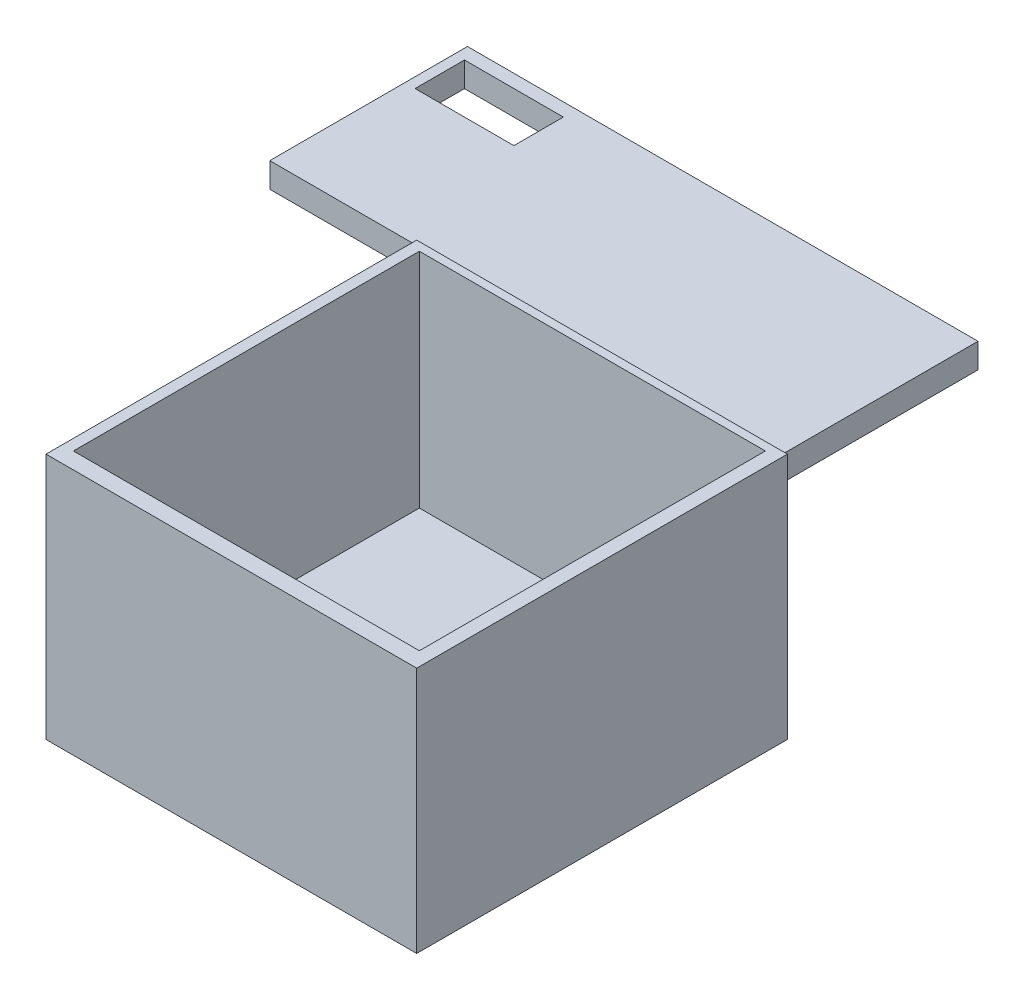
ISO-10303-21;
HEADER;
FILE_DESCRIPTION(('STEP AP214'),'2;1');
FILE_NAME('part.step','',(''),(''),'','','');
FILE_SCHEMA(('AUTOMOTIVE_DESIGN { 1 0 10303 214 1 1 1 1 }'));
ENDSEC;
DATA;
#1=APPLICATION_CONTEXT('core data for automotive mechanical design processes');
#2=APPLICATION_PROTOCOL_DEFINITION('international standard','automotive_design',2000,#1);
#3=PRODUCT_CONTEXT('',#1,'mechanical');
#4=PRODUCT('Part','Part','',(#3));
#5=PRODUCT_RELATED_PRODUCT_CATEGORY('part','',(#4));
#6=PRODUCT_DEFINITION_FORMATION('','',#4);
#7=PRODUCT_DEFINITION_CONTEXT('part definition',#1,'design');
#8=PRODUCT_DEFINITION('design','',#6,#7);
#9=PRODUCT_DEFINITION_SHAPE('','',#8);
#10=(LENGTH_UNIT() NAMED_UNIT(*) SI_UNIT(.MILLI.,.METRE.));
#11=(NAMED_UNIT(*) PLANE_ANGLE_UNIT() SI_UNIT($,.RADIAN.));
#12=(NAMED_UNIT(*) SI_UNIT($,.STERADIAN.) SOLID_ANGLE_UNIT());
#13=UNCERTAINTY_MEASURE_WITH_UNIT(LENGTH_MEASURE(1.E-05),#10,'distance_accuracy_value','');
#14=(GEOMETRIC_REPRESENTATION_CONTEXT(3) GLOBAL_UNCERTAINTY_ASSIGNED_CONTEXT((#13)) GLOBAL_UNIT_ASSIGNED_CONTEXT((#10,
#11,#12)) REPRESENTATION_CONTEXT('',''));
#15=CARTESIAN_POINT('',(0.,0.,0.));
#16=DIRECTION('',(0.,0.,1.));
#17=DIRECTION('',(1.,0.,0.));
#18=AXIS2_PLACEMENT_3D('',#15,#16,#17);
#19=CARTESIAN_POINT('',(-136.989619377163,100.,-6.05536332179931));
#20=DIRECTION('',(0.,0.,1.));
#21=DIRECTION('',(1.,0.,0.));
#22=AXIS2_PLACEMENT_3D('',#19,#20,#21);
#23=PLANE('',#22);
#24=DIRECTION('',(1.,0.,0.));
#25=VECTOR('',#24,1.);
#26=CARTESIAN_POINT('',(10.1416415350002,98.1246631452138,-6.05536332179931));
#27=LINE('',#26,#25);
#28=CARTESIAN_POINT('',(-136.989619377163,98.1246631452138,-6.05536332179931));
#29=VERTEX_POINT('',#28);
#30=CARTESIAN_POINT('',(10.1416415350002,98.1246631452138,-6.05536332179931));
#31=VERTEX_POINT('',#30);
#32=EDGE_CURVE('E206',#29,#31,#27,.T.);
#33=ORIENTED_EDGE('',*,*,#32,.F.);
#34=DIRECTION('',(0.,-1.,0.));
#35=VECTOR('',#34,1.);
#36=CARTESIAN_POINT('',(-136.989619377163,100.,-6.05536332179931));
#37=LINE('',#36,#35);
#38=CARTESIAN_POINT('',(-136.989619377163,100.,-6.05536332179931));
#39=VERTEX_POINT('',#38);
#40=EDGE_CURVE('E270',#39,#29,#37,.T.);
#41=ORIENTED_EDGE('',*,*,#40,.F.);
#42=DIRECTION('',(-1.,0.,0.));
#43=VECTOR('',#42,1.);
#44=CARTESIAN_POINT('',(-136.989619377163,100.,-6.05536332179931));
#45=LINE('',#44,#43);
#46=CARTESIAN_POINT('',(13.0103806228373,100.,-6.05536332179931));
#47=VERTEX_POINT('',#46);
#48=EDGE_CURVE('E259',#47,#39,#45,.T.);
#49=ORIENTED_EDGE('',*,*,#48,.F.);
#50=DIRECTION('',(0.,-1.,0.));
#51=VECTOR('',#50,1.);
#52=CARTESIAN_POINT('',(13.0103806228373,100.,-6.05536332179931));
#53=LINE('',#52,#51);
#54=CARTESIAN_POINT('',(13.0103806228373,0.,-6.05536332179931));
#55=VERTEX_POINT('',#54);
#56=EDGE_CURVE('E273',#47,#55,#53,.T.);
#57=ORIENTED_EDGE('',*,*,#56,.T.);
#58=DIRECTION('',(-1.,0.,0.));
#59=VECTOR('',#58,1.);
#60=CARTESIAN_POINT('',(-136.989619377163,0.,-6.05536332179931));
#61=LINE('',#60,#59);
#62=CARTESIAN_POINT('',(-136.989619377163,0.,-6.05536332179931));
#63=VERTEX_POINT('',#62);
#64=EDGE_CURVE('E255',#55,#63,#61,.T.);
#65=ORIENTED_EDGE('',*,*,#64,.T.);
#66=CARTESIAN_POINT('',(-136.989619377163,88.0799767352443,-6.05536332179931));
#67=VERTEX_POINT('',#66);
#68=EDGE_CURVE('E261',#67,#63,#37,.T.);
#69=ORIENTED_EDGE('',*,*,#68,.F.);
#70=DIRECTION('',(-1.,0.,0.));
#71=VECTOR('',#70,1.);
#72=CARTESIAN_POINT('',(10.1416415350002,88.0799767352443,-6.05536332179931));
#73=LINE('',#72,#71);
#74=CARTESIAN_POINT('',(10.1416415350002,88.0799767352443,-6.05536332179931));
#75=VERTEX_POINT('',#74);
#76=EDGE_CURVE('E199',#75,#67,#73,.T.);
#77=ORIENTED_EDGE('',*,*,#76,.F.);
#78=DIRECTION('',(0.,-1.,0.));
#79=VECTOR('',#78,1.);
#80=CARTESIAN_POINT('',(10.1416415350002,98.1246631452138,-6.05536332179931));
#81=LINE('',#80,#79);
#82=EDGE_CURVE('E182',#31,#75,#81,.T.);
#83=ORIENTED_EDGE('',*,*,#82,.F.);
#84=EDGE_LOOP('',(#33,#41,#49,#57,#65,#69,#77,#83));
#85=FACE_BOUND('',#84,.T.);
#86=ADVANCED_FACE('F37',(#85),#23,.F.);
#87=CARTESIAN_POINT('',(-136.989619377163,100.,-6.05536332179931));
#88=DIRECTION('',(1.,0.,0.));
#89=DIRECTION('',(0.,0.,-1.));
#90=AXIS2_PLACEMENT_3D('',#87,#88,#89);
#91=PLANE('',#90);
#92=DIRECTION('',(0.,0.,1.));
#93=VECTOR('',#92,1.);
#94=CARTESIAN_POINT('',(-136.989619377163,0.,-6.05536332179931));
#95=LINE('',#94,#93);
#96=CARTESIAN_POINT('',(-136.989619377163,0.,143.944636678201));
#97=VERTEX_POINT('',#96);
#98=EDGE_CURVE('E244',#63,#97,#95,.T.);
#99=ORIENTED_EDGE('',*,*,#98,.T.);
#100=DIRECTION('',(0.,-1.,0.));
#101=VECTOR('',#100,1.);
#102=CARTESIAN_POINT('',(-136.989619377163,100.,143.944636678201));
#103=LINE('',#102,#101);
#104=CARTESIAN_POINT('',(-136.989619377163,100.,143.944636678201));
#105=VERTEX_POINT('',#104);
#106=EDGE_CURVE('E280',#105,#97,#103,.T.);
#107=ORIENTED_EDGE('',*,*,#106,.F.);
#108=DIRECTION('',(0.,0.,1.));
#109=VECTOR('',#108,1.);
#110=CARTESIAN_POINT('',(-136.989619377163,100.,-6.05536332179931));
#111=LINE('',#110,#109);
#112=EDGE_CURVE('E251',#39,#105,#111,.T.);
#113=ORIENTED_EDGE('',*,*,#112,.F.);
#114=ORIENTED_EDGE('',*,*,#40,.T.);
#115=EDGE_CURVE('E274',#29,#67,#37,.T.);
#116=ORIENTED_EDGE('',*,*,#115,.T.);
#117=ORIENTED_EDGE('',*,*,#68,.T.);
#118=EDGE_LOOP('',(#99,#107,#113,#114,#116,#117));
#119=FACE_BOUND('',#118,.T.);
#120=ADVANCED_FACE('F39',(#119),#91,.F.);
#121=CARTESIAN_POINT('',(-136.989619377163,100.,143.944636678201));
#122=DIRECTION('',(0.,0.,-1.));
#123=DIRECTION('',(-1.,0.,0.));
#124=AXIS2_PLACEMENT_3D('',#121,#122,#123);
#125=PLANE('',#124);
#126=DIRECTION('',(1.,0.,0.));
#127=VECTOR('',#126,1.);
#128=CARTESIAN_POINT('',(-136.989619377163,0.,143.944636678201));
#129=LINE('',#128,#127);
#130=CARTESIAN_POINT('',(13.0103806228374,0.,143.944636678201));
#131=VERTEX_POINT('',#130);
#132=EDGE_CURVE('E264',#97,#131,#129,.T.);
#133=ORIENTED_EDGE('',*,*,#132,.T.);
#134=DIRECTION('',(0.,-1.,0.));
#135=VECTOR('',#134,1.);
#136=CARTESIAN_POINT('',(13.0103806228374,100.,143.944636678201));
#137=LINE('',#136,#135);
#138=CARTESIAN_POINT('',(13.0103806228374,100.,143.944636678201));
#139=VERTEX_POINT('',#138);
#140=EDGE_CURVE('E277',#139,#131,#137,.T.);
#141=ORIENTED_EDGE('',*,*,#140,.F.);
#142=DIRECTION('',(1.,0.,0.));
#143=VECTOR('',#142,1.);
#144=CARTESIAN_POINT('',(-136.989619377163,100.,143.944636678201));
#145=LINE('',#144,#143);
#146=EDGE_CURVE('E254',#105,#139,#145,.T.);
#147=ORIENTED_EDGE('',*,*,#146,.F.);
#148=ORIENTED_EDGE('',*,*,#106,.T.);
#149=EDGE_LOOP('',(#133,#141,#147,#148));
#150=FACE_BOUND('',#149,.T.);
#151=ADVANCED_FACE('F312',(#150),#125,.F.);
#152=CARTESIAN_POINT('',(13.0103806228373,100.,-6.05536332179931));
#153=DIRECTION('',(-1.,0.,0.));
#154=DIRECTION('',(0.,0.,1.));
#155=AXIS2_PLACEMENT_3D('',#152,#153,#154);
#156=PLANE('',#155);
#157=DIRECTION('',(0.,0.,-1.));
#158=VECTOR('',#157,1.);
#159=CARTESIAN_POINT('',(13.0103806228373,0.,-6.05536332179931));
#160=LINE('',#159,#158);
#161=EDGE_CURVE('E266',#131,#55,#160,.T.);
#162=ORIENTED_EDGE('',*,*,#161,.T.);
#163=ORIENTED_EDGE('',*,*,#56,.F.);
#164=DIRECTION('',(0.,0.,-1.));
#165=VECTOR('',#164,1.);
#166=CARTESIAN_POINT('',(13.0103806228373,100.,-6.05536332179931));
#167=LINE('',#166,#165);
#168=EDGE_CURVE('E257',#139,#47,#167,.T.);
#169=ORIENTED_EDGE('',*,*,#168,.F.);
#170=ORIENTED_EDGE('',*,*,#140,.T.);
#171=EDGE_LOOP('',(#162,#163,#169,#170));
#172=FACE_BOUND('',#171,.T.);
#173=ADVANCED_FACE('F318',(#172),#156,.F.);
#174=CARTESIAN_POINT('',(0.,100.,0.));
#175=DIRECTION('',(0.,1.,0.));
#176=DIRECTION('',(0.,0.,1.));
#177=AXIS2_PLACEMENT_3D('',#174,#175,#176);
#178=PLANE('',#177);
#179=DIRECTION('',(0.,0.,1.));
#180=VECTOR('',#179,1.);
#181=CARTESIAN_POINT('',(-132.547413878201,100.,-2.70444611989906));
#182=LINE('',#181,#180);
#183=CARTESIAN_POINT('',(-132.547413878201,100.,-2.70444611989906));
#184=VERTEX_POINT('',#183);
#185=CARTESIAN_POINT('',(-132.547413878201,100.,137.295553880101));
#186=VERTEX_POINT('',#185);
#187=EDGE_CURVE('E218',#184,#186,#182,.T.);
#188=ORIENTED_EDGE('',*,*,#187,.F.);
#189=DIRECTION('',(-1.,0.,0.));
#190=VECTOR('',#189,1.);
#191=CARTESIAN_POINT('',(-132.547413878201,100.,-2.70444611989906));
#192=LINE('',#191,#190);
#193=CARTESIAN_POINT('',(7.4525861217988,100.,-2.70444611989906));
#194=VERTEX_POINT('',#193);
#195=EDGE_CURVE('E223',#194,#184,#192,.T.);
#196=ORIENTED_EDGE('',*,*,#195,.F.);
#197=DIRECTION('',(0.,0.,-1.));
#198=VECTOR('',#197,1.);
#199=CARTESIAN_POINT('',(7.4525861217988,100.,-2.70444611989906));
#200=LINE('',#199,#198);
#201=CARTESIAN_POINT('',(7.4525861217988,100.,137.295553880101));
#202=VERTEX_POINT('',#201);
#203=EDGE_CURVE('E237',#202,#194,#200,.T.);
#204=ORIENTED_EDGE('',*,*,#203,.F.);
#205=DIRECTION('',(1.,0.,0.));
#206=VECTOR('',#205,1.);
#207=CARTESIAN_POINT('',(-132.547413878201,100.,137.295553880101));
#208=LINE('',#207,#206);
#209=EDGE_CURVE('E234',#186,#202,#208,.T.);
#210=ORIENTED_EDGE('',*,*,#209,.F.);
#211=EDGE_LOOP('',(#188,#196,#204,#210));
#212=FACE_BOUND('',#211,.T.);
#213=ORIENTED_EDGE('',*,*,#112,.T.);
#214=ORIENTED_EDGE('',*,*,#146,.T.);
#215=ORIENTED_EDGE('',*,*,#168,.T.);
#216=ORIENTED_EDGE('',*,*,#48,.T.);
#217=EDGE_LOOP('',(#213,#214,#215,#216));
#218=FACE_BOUND('',#217,.T.);
#219=ADVANCED_FACE('F320',(#212,#218),#178,.T.);
#220=CARTESIAN_POINT('',(0.,0.,0.));
#221=DIRECTION('',(0.,1.,0.));
#222=DIRECTION('',(0.,0.,1.));
#223=AXIS2_PLACEMENT_3D('',#220,#221,#222);
#224=PLANE('',#223);
#225=ORIENTED_EDGE('',*,*,#98,.F.);
#226=ORIENTED_EDGE('',*,*,#64,.F.);
#227=ORIENTED_EDGE('',*,*,#161,.F.);
#228=ORIENTED_EDGE('',*,*,#132,.F.);
#229=EDGE_LOOP('',(#225,#226,#227,#228));
#230=FACE_BOUND('',#229,.T.);
#231=ADVANCED_FACE('F316',(#230),#224,.F.);
#232=CARTESIAN_POINT('',(-132.547413878201,10.,-2.70444611989906));
#233=DIRECTION('',(-1.,0.,0.));
#234=DIRECTION('',(0.,0.,1.));
#235=AXIS2_PLACEMENT_3D('',#232,#233,#234);
#236=PLANE('',#235);
#237=ORIENTED_EDGE('',*,*,#187,.T.);
#238=DIRECTION('',(0.,1.,0.));
#239=VECTOR('',#238,1.);
#240=CARTESIAN_POINT('',(-132.547413878201,10.,137.295553880101));
#241=LINE('',#240,#239);
#242=CARTESIAN_POINT('',(-132.547413878201,10.,137.295553880101));
#243=VERTEX_POINT('',#242);
#244=EDGE_CURVE('E232',#243,#186,#241,.T.);
#245=ORIENTED_EDGE('',*,*,#244,.F.);
#246=DIRECTION('',(0.,0.,1.));
#247=VECTOR('',#246,1.);
#248=CARTESIAN_POINT('',(-132.547413878201,10.,-2.70444611989906));
#249=LINE('',#248,#247);
#250=CARTESIAN_POINT('',(-132.547413878201,10.,-2.70444611989906));
#251=VERTEX_POINT('',#250);
#252=EDGE_CURVE('E219',#251,#243,#249,.T.);
#253=ORIENTED_EDGE('',*,*,#252,.F.);
#254=DIRECTION('',(0.,1.,0.));
#255=VECTOR('',#254,1.);
#256=CARTESIAN_POINT('',(-132.547413878201,10.,-2.70444611989906));
#257=LINE('',#256,#255);
#258=EDGE_CURVE('E242',#251,#184,#257,.T.);
#259=ORIENTED_EDGE('',*,*,#258,.T.);
#260=EDGE_LOOP('',(#237,#245,#253,#259));
#261=FACE_BOUND('',#260,.T.);
#262=ADVANCED_FACE('F377',(#261),#236,.F.);
#263=CARTESIAN_POINT('',(-132.547413878201,10.,-2.70444611989906));
#264=DIRECTION('',(0.,0.,-1.));
#265=DIRECTION('',(-1.,0.,0.));
#266=AXIS2_PLACEMENT_3D('',#263,#264,#265);
#267=PLANE('',#266);
#268=ORIENTED_EDGE('',*,*,#195,.T.);
#269=ORIENTED_EDGE('',*,*,#258,.F.);
#270=DIRECTION('',(-1.,0.,0.));
#271=VECTOR('',#270,1.);
#272=CARTESIAN_POINT('',(-132.547413878201,10.,-2.70444611989906));
#273=LINE('',#272,#271);
#274=CARTESIAN_POINT('',(7.4525861217988,10.,-2.70444611989906));
#275=VERTEX_POINT('',#274);
#276=EDGE_CURVE('E229',#275,#251,#273,.T.);
#277=ORIENTED_EDGE('',*,*,#276,.F.);
#278=DIRECTION('',(0.,1.,0.));
#279=VECTOR('',#278,1.);
#280=CARTESIAN_POINT('',(7.4525861217988,10.,-2.70444611989906));
#281=LINE('',#280,#279);
#282=EDGE_CURVE('E245',#275,#194,#281,.T.);
#283=ORIENTED_EDGE('',*,*,#282,.T.);
#284=EDGE_LOOP('',(#268,#269,#277,#283));
#285=FACE_BOUND('',#284,.T.);
#286=ADVANCED_FACE('F373',(#285),#267,.F.);
#287=CARTESIAN_POINT('',(7.4525861217988,10.,-2.70444611989906));
#288=DIRECTION('',(1.,0.,0.));
#289=DIRECTION('',(0.,0.,-1.));
#290=AXIS2_PLACEMENT_3D('',#287,#288,#289);
#291=PLANE('',#290);
#292=ORIENTED_EDGE('',*,*,#203,.T.);
#293=ORIENTED_EDGE('',*,*,#282,.F.);
#294=DIRECTION('',(0.,0.,-1.));
#295=VECTOR('',#294,1.);
#296=CARTESIAN_POINT('',(7.4525861217988,10.,-2.70444611989906));
#297=LINE('',#296,#295);
#298=CARTESIAN_POINT('',(7.4525861217988,10.,137.295553880101));
#299=VERTEX_POINT('',#298);
#300=EDGE_CURVE('E226',#299,#275,#297,.T.);
#301=ORIENTED_EDGE('',*,*,#300,.F.);
#302=DIRECTION('',(0.,1.,0.));
#303=VECTOR('',#302,1.);
#304=CARTESIAN_POINT('',(7.4525861217988,10.,137.295553880101));
#305=LINE('',#304,#303);
#306=EDGE_CURVE('E247',#299,#202,#305,.T.);
#307=ORIENTED_EDGE('',*,*,#306,.T.);
#308=EDGE_LOOP('',(#292,#293,#301,#307));
#309=FACE_BOUND('',#308,.T.);
#310=ADVANCED_FACE('F376',(#309),#291,.F.);
#311=CARTESIAN_POINT('',(-132.547413878201,10.,137.295553880101));
#312=DIRECTION('',(0.,0.,1.));
#313=DIRECTION('',(1.,0.,0.));
#314=AXIS2_PLACEMENT_3D('',#311,#312,#313);
#315=PLANE('',#314);
#316=ORIENTED_EDGE('',*,*,#209,.T.);
#317=ORIENTED_EDGE('',*,*,#306,.F.);
#318=DIRECTION('',(1.,0.,0.));
#319=VECTOR('',#318,1.);
#320=CARTESIAN_POINT('',(-132.547413878201,10.,137.295553880101));
#321=LINE('',#320,#319);
#322=EDGE_CURVE('E222',#243,#299,#321,.T.);
#323=ORIENTED_EDGE('',*,*,#322,.F.);
#324=ORIENTED_EDGE('',*,*,#244,.T.);
#325=EDGE_LOOP('',(#316,#317,#323,#324));
#326=FACE_BOUND('',#325,.T.);
#327=ADVANCED_FACE('F371',(#326),#315,.F.);
#328=CARTESIAN_POINT('',(0.,10.,0.));
#329=DIRECTION('',(0.,1.,0.));
#330=DIRECTION('',(0.,0.,1.));
#331=AXIS2_PLACEMENT_3D('',#328,#329,#330);
#332=PLANE('',#331);
#333=ORIENTED_EDGE('',*,*,#252,.T.);
#334=ORIENTED_EDGE('',*,*,#322,.T.);
#335=ORIENTED_EDGE('',*,*,#300,.T.);
#336=ORIENTED_EDGE('',*,*,#276,.T.);
#337=EDGE_LOOP('',(#333,#334,#335,#336));
#338=FACE_BOUND('',#337,.T.);
#339=ADVANCED_FACE('F368',(#338),#332,.T.);
#340=CARTESIAN_POINT('',(10.1416415350002,98.1246631452138,-86.0553633217993));
#341=DIRECTION('',(-1.,0.,0.));
#342=DIRECTION('',(0.,0.,1.));
#343=AXIS2_PLACEMENT_3D('',#340,#341,#342);
#344=PLANE('',#343);
#345=ORIENTED_EDGE('',*,*,#82,.T.);
#346=DIRECTION('',(0.,0.,1.));
#347=VECTOR('',#346,1.);
#348=CARTESIAN_POINT('',(10.1416415350002,88.0799767352443,-86.0553633217993));
#349=LINE('',#348,#347);
#350=CARTESIAN_POINT('',(10.1416415350002,88.0799767352443,-86.0553633217993));
#351=VERTEX_POINT('',#350);
#352=EDGE_CURVE('E215',#351,#75,#349,.T.);
#353=ORIENTED_EDGE('',*,*,#352,.F.);
#354=DIRECTION('',(0.,-1.,0.));
#355=VECTOR('',#354,1.);
#356=CARTESIAN_POINT('',(10.1416415350002,98.1246631452138,-86.0553633217993));
#357=LINE('',#356,#355);
#358=CARTESIAN_POINT('',(10.1416415350002,98.1246631452138,-86.0553633217993));
#359=VERTEX_POINT('',#358);
#360=EDGE_CURVE('E185',#359,#351,#357,.T.);
#361=ORIENTED_EDGE('',*,*,#360,.F.);
#362=DIRECTION('',(0.,0.,1.));
#363=VECTOR('',#362,1.);
#364=CARTESIAN_POINT('',(10.1416415350002,98.1246631452138,-86.0553633217993));
#365=LINE('',#364,#363);
#366=EDGE_CURVE('E195',#359,#31,#365,.T.);
#367=ORIENTED_EDGE('',*,*,#366,.T.);
#368=EDGE_LOOP('',(#345,#353,#361,#367));
#369=FACE_BOUND('',#368,.T.);
#370=ADVANCED_FACE('F353',(#369),#344,.F.);
#371=CARTESIAN_POINT('',(10.1416415350002,88.0799767352443,-86.0553633217993));
#372=DIRECTION('',(0.,1.,0.));
#373=DIRECTION('',(0.,0.,1.));
#374=AXIS2_PLACEMENT_3D('',#371,#372,#373);
#375=PLANE('',#374);
#376=DIRECTION('',(1.,0.,0.));
#377=VECTOR('',#376,1.);
#378=CARTESIAN_POINT('',(-192.313011015828,88.0799767352443,-80.7127762708817));
#379=LINE('',#378,#377);
#380=CARTESIAN_POINT('',(-192.313011015828,88.0799767352443,-80.7127762708817));
#381=VERTEX_POINT('',#380);
#382=CARTESIAN_POINT('',(-152.313011015828,88.0799767352443,-80.7127762708817));
#383=VERTEX_POINT('',#382);
#384=EDGE_CURVE('E168',#381,#383,#379,.T.);
#385=ORIENTED_EDGE('',*,*,#384,.F.);
#386=DIRECTION('',(0.,0.,-1.));
#387=VECTOR('',#386,1.);
#388=CARTESIAN_POINT('',(-192.313011015828,88.0799767352443,-60.7127762708816));
#389=LINE('',#388,#387);
#390=CARTESIAN_POINT('',(-192.313011015828,88.0799767352443,-60.7127762708816));
#391=VERTEX_POINT('',#390);
#392=EDGE_CURVE('E52',#391,#381,#389,.T.);
#393=ORIENTED_EDGE('',*,*,#392,.F.);
#394=DIRECTION('',(-1.,0.,0.));
#395=VECTOR('',#394,1.);
#396=CARTESIAN_POINT('',(-192.313011015828,88.0799767352443,-60.7127762708816));
#397=LINE('',#396,#395);
#398=CARTESIAN_POINT('',(-152.313011015828,88.0799767352443,-60.7127762708817));
#399=VERTEX_POINT('',#398);
#400=EDGE_CURVE('E175',#399,#391,#397,.T.);
#401=ORIENTED_EDGE('',*,*,#400,.F.);
#402=DIRECTION('',(0.,0.,1.));
#403=VECTOR('',#402,1.);
#404=CARTESIAN_POINT('',(-152.313011015828,88.0799767352443,-60.7127762708817));
#405=LINE('',#404,#403);
#406=EDGE_CURVE('E159',#383,#399,#405,.T.);
#407=ORIENTED_EDGE('',*,*,#406,.F.);
#408=EDGE_LOOP('',(#385,#393,#401,#407));
#409=FACE_BOUND('',#408,.T.);
#410=ORIENTED_EDGE('',*,*,#76,.T.);
#411=CARTESIAN_POINT('',(-196.442882259114,88.0799767352443,-6.05536332179931));
#412=VERTEX_POINT('',#411);
#413=EDGE_CURVE('E198',#67,#412,#73,.T.);
#414=ORIENTED_EDGE('',*,*,#413,.T.);
#415=DIRECTION('',(0.,0.,1.));
#416=VECTOR('',#415,1.);
#417=CARTESIAN_POINT('',(-196.442882259114,88.0799767352443,-86.0553633217993));
#418=LINE('',#417,#416);
#419=CARTESIAN_POINT('',(-196.442882259114,88.0799767352443,-86.0553633217993));
#420=VERTEX_POINT('',#419);
#421=EDGE_CURVE('E212',#420,#412,#418,.T.);
#422=ORIENTED_EDGE('',*,*,#421,.F.);
#423=DIRECTION('',(-1.,0.,0.));
#424=VECTOR('',#423,1.);
#425=CARTESIAN_POINT('',(10.1416415350002,88.0799767352443,-86.0553633217993));
#426=LINE('',#425,#424);
#427=EDGE_CURVE('E188',#351,#420,#426,.T.);
#428=ORIENTED_EDGE('',*,*,#427,.F.);
#429=ORIENTED_EDGE('',*,*,#352,.T.);
#430=EDGE_LOOP('',(#410,#414,#422,#428,#429));
#431=FACE_BOUND('',#430,.T.);
#432=ADVANCED_FACE('F172',(#409,#431),#375,.F.);
#433=CARTESIAN_POINT('',(-196.442882259114,98.1246631452138,-86.0553633217993));
#434=DIRECTION('',(1.,0.,0.));
#435=DIRECTION('',(0.,0.,-1.));
#436=AXIS2_PLACEMENT_3D('',#433,#434,#435);
#437=PLANE('',#436);
#438=DIRECTION('',(0.,1.,0.));
#439=VECTOR('',#438,1.);
#440=CARTESIAN_POINT('',(-196.442882259114,98.1246631452138,-6.05536332179931));
#441=LINE('',#440,#439);
#442=CARTESIAN_POINT('',(-196.442882259114,98.1246631452138,-6.05536332179931));
#443=VERTEX_POINT('',#442);
#444=EDGE_CURVE('E202',#412,#443,#441,.T.);
#445=ORIENTED_EDGE('',*,*,#444,.T.);
#446=DIRECTION('',(0.,0.,1.));
#447=VECTOR('',#446,1.);
#448=CARTESIAN_POINT('',(-196.442882259114,98.1246631452138,-86.0553633217993));
#449=LINE('',#448,#447);
#450=CARTESIAN_POINT('',(-196.442882259114,98.1246631452138,-86.0553633217993));
#451=VERTEX_POINT('',#450);
#452=EDGE_CURVE('E209',#451,#443,#449,.T.);
#453=ORIENTED_EDGE('',*,*,#452,.F.);
#454=DIRECTION('',(0.,1.,0.));
#455=VECTOR('',#454,1.);
#456=CARTESIAN_POINT('',(-196.442882259114,98.1246631452138,-86.0553633217993));
#457=LINE('',#456,#455);
#458=EDGE_CURVE('E191',#420,#451,#457,.T.);
#459=ORIENTED_EDGE('',*,*,#458,.F.);
#460=ORIENTED_EDGE('',*,*,#421,.T.);
#461=EDGE_LOOP('',(#445,#453,#459,#460));
#462=FACE_BOUND('',#461,.T.);
#463=ADVANCED_FACE('F349',(#462),#437,.F.);
#464=CARTESIAN_POINT('',(10.1416415350002,98.1246631452138,-86.0553633217993));
#465=DIRECTION('',(0.,-1.,0.));
#466=DIRECTION('',(0.,0.,-1.));
#467=AXIS2_PLACEMENT_3D('',#464,#465,#466);
#468=PLANE('',#467);
#469=DIRECTION('',(-1.,0.,0.));
#470=VECTOR('',#469,1.);
#471=CARTESIAN_POINT('',(10.1416415350002,98.1246631452138,-60.7127762708817));
#472=LINE('',#471,#470);
#473=CARTESIAN_POINT('',(-152.313011015828,98.1246631452138,-60.7127762708817));
#474=VERTEX_POINT('',#473);
#475=CARTESIAN_POINT('',(-192.313011015828,98.1246631452138,-60.7127762708816));
#476=VERTEX_POINT('',#475);
#477=EDGE_CURVE('E45',#474,#476,#472,.T.);
#478=ORIENTED_EDGE('',*,*,#477,.T.);
#479=DIRECTION('',(0.,0.,-1.));
#480=VECTOR('',#479,1.);
#481=CARTESIAN_POINT('',(-192.313011015828,98.1246631452138,-86.0553633217993));
#482=LINE('',#481,#480);
#483=CARTESIAN_POINT('',(-192.313011015828,98.1246631452138,-80.7127762708817));
#484=VERTEX_POINT('',#483);
#485=EDGE_CURVE('E11',#476,#484,#482,.T.);
#486=ORIENTED_EDGE('',*,*,#485,.T.);
#487=DIRECTION('',(1.,0.,0.));
#488=VECTOR('',#487,1.);
#489=CARTESIAN_POINT('',(10.1416415350002,98.1246631452138,-80.7127762708817));
#490=LINE('',#489,#488);
#491=CARTESIAN_POINT('',(-152.313011015828,98.1246631452138,-80.7127762708817));
#492=VERTEX_POINT('',#491);
#493=EDGE_CURVE('E283',#484,#492,#490,.T.);
#494=ORIENTED_EDGE('',*,*,#493,.T.);
#495=DIRECTION('',(0.,0.,1.));
#496=VECTOR('',#495,1.);
#497=CARTESIAN_POINT('',(-152.313011015828,98.1246631452138,-86.0553633217993));
#498=LINE('',#497,#496);
#499=EDGE_CURVE('E162',#492,#474,#498,.T.);
#500=ORIENTED_EDGE('',*,*,#499,.T.);
#501=EDGE_LOOP('',(#478,#486,#494,#500));
#502=FACE_BOUND('',#501,.T.);
#503=EDGE_CURVE('E189',#443,#29,#27,.T.);
#504=ORIENTED_EDGE('',*,*,#503,.T.);
#505=ORIENTED_EDGE('',*,*,#32,.T.);
#506=ORIENTED_EDGE('',*,*,#366,.F.);
#507=DIRECTION('',(1.,0.,0.));
#508=VECTOR('',#507,1.);
#509=CARTESIAN_POINT('',(10.1416415350002,98.1246631452138,-86.0553633217993));
#510=LINE('',#509,#508);
#511=EDGE_CURVE('E193',#451,#359,#510,.T.);
#512=ORIENTED_EDGE('',*,*,#511,.F.);
#513=ORIENTED_EDGE('',*,*,#452,.T.);
#514=EDGE_LOOP('',(#504,#505,#506,#512,#513));
#515=FACE_BOUND('',#514,.T.);
#516=ADVANCED_FACE('F287',(#502,#515),#468,.F.);
#517=CARTESIAN_POINT('',(0.,0.,-86.0553633217993));
#518=DIRECTION('',(0.,0.,-1.));
#519=DIRECTION('',(-1.,0.,0.));
#520=AXIS2_PLACEMENT_3D('',#517,#518,#519);
#521=PLANE('',#520);
#522=ORIENTED_EDGE('',*,*,#360,.T.);
#523=ORIENTED_EDGE('',*,*,#427,.T.);
#524=ORIENTED_EDGE('',*,*,#458,.T.);
#525=ORIENTED_EDGE('',*,*,#511,.T.);
#526=EDGE_LOOP('',(#522,#523,#524,#525));
#527=FACE_BOUND('',#526,.T.);
#528=ADVANCED_FACE('F301',(#527),#521,.T.);
#529=CARTESIAN_POINT('',(0.,0.,-6.05536332179931));
#530=DIRECTION('',(0.,0.,-1.));
#531=DIRECTION('',(-1.,0.,0.));
#532=AXIS2_PLACEMENT_3D('',#529,#530,#531);
#533=PLANE('',#532);
#534=ORIENTED_EDGE('',*,*,#115,.F.);
#535=ORIENTED_EDGE('',*,*,#503,.F.);
#536=ORIENTED_EDGE('',*,*,#444,.F.);
#537=ORIENTED_EDGE('',*,*,#413,.F.);
#538=EDGE_LOOP('',(#534,#535,#536,#537));
#539=FACE_BOUND('',#538,.T.);
#540=ADVANCED_FACE('F294',(#539),#533,.F.);
#541=CARTESIAN_POINT('',(-192.313011015828,108.079976735244,-60.7127762708816));
#542=DIRECTION('',(-1.,0.,0.));
#543=DIRECTION('',(0.,0.,1.));
#544=AXIS2_PLACEMENT_3D('',#541,#542,#543);
#545=PLANE('',#544);
#546=DIRECTION('',(0.,-1.,0.));
#547=VECTOR('',#546,1.);
#548=CARTESIAN_POINT('',(-192.313011015828,108.079976735244,-60.7127762708816));
#549=LINE('',#548,#547);
#550=EDGE_CURVE('E180',#476,#391,#549,.T.);
#551=ORIENTED_EDGE('',*,*,#550,.T.);
#552=ORIENTED_EDGE('',*,*,#392,.T.);
#553=DIRECTION('',(0.,-1.,0.));
#554=VECTOR('',#553,1.);
#555=CARTESIAN_POINT('',(-192.313011015828,108.079976735244,-80.7127762708817));
#556=LINE('',#555,#554);
#557=EDGE_CURVE('E165',#484,#381,#556,.T.);
#558=ORIENTED_EDGE('',*,*,#557,.F.);
#559=ORIENTED_EDGE('',*,*,#485,.F.);
#560=EDGE_LOOP('',(#551,#552,#558,#559));
#561=FACE_BOUND('',#560,.T.);
#562=ADVANCED_FACE('F292',(#561),#545,.F.);
#563=CARTESIAN_POINT('',(-192.313011015828,108.079976735244,-60.7127762708816));
#564=DIRECTION('',(0.,0.,1.));
#565=DIRECTION('',(1.,0.,0.));
#566=AXIS2_PLACEMENT_3D('',#563,#564,#565);
#567=PLANE('',#566);
#568=DIRECTION('',(0.,-1.,0.));
#569=VECTOR('',#568,1.);
#570=CARTESIAN_POINT('',(-152.313011015828,108.079976735244,-60.7127762708817));
#571=LINE('',#570,#569);
#572=EDGE_CURVE('E164',#474,#399,#571,.T.);
#573=ORIENTED_EDGE('',*,*,#572,.T.);
#574=ORIENTED_EDGE('',*,*,#400,.T.);
#575=ORIENTED_EDGE('',*,*,#550,.F.);
#576=ORIENTED_EDGE('',*,*,#477,.F.);
#577=EDGE_LOOP('',(#573,#574,#575,#576));
#578=FACE_BOUND('',#577,.T.);
#579=ADVANCED_FACE('F291',(#578),#567,.F.);
#580=CARTESIAN_POINT('',(-152.313011015828,108.079976735244,-60.7127762708817));
#581=DIRECTION('',(1.,0.,0.));
#582=DIRECTION('',(0.,0.,-1.));
#583=AXIS2_PLACEMENT_3D('',#580,#581,#582);
#584=PLANE('',#583);
#585=DIRECTION('',(0.,-1.,0.));
#586=VECTOR('',#585,1.);
#587=CARTESIAN_POINT('',(-152.313011015828,108.079976735244,-80.7127762708817));
#588=LINE('',#587,#586);
#589=EDGE_CURVE('E60',#492,#383,#588,.T.);
#590=ORIENTED_EDGE('',*,*,#589,.T.);
#591=ORIENTED_EDGE('',*,*,#406,.T.);
#592=ORIENTED_EDGE('',*,*,#572,.F.);
#593=ORIENTED_EDGE('',*,*,#499,.F.);
#594=EDGE_LOOP('',(#590,#591,#592,#593));
#595=FACE_BOUND('',#594,.T.);
#596=ADVANCED_FACE('F156',(#595),#584,.F.);
#597=CARTESIAN_POINT('',(-192.313011015828,108.079976735244,-80.7127762708817));
#598=DIRECTION('',(0.,0.,-1.));
#599=DIRECTION('',(-1.,0.,0.));
#600=AXIS2_PLACEMENT_3D('',#597,#598,#599);
#601=PLANE('',#600);
#602=ORIENTED_EDGE('',*,*,#557,.T.);
#603=ORIENTED_EDGE('',*,*,#384,.T.);
#604=ORIENTED_EDGE('',*,*,#589,.F.);
#605=ORIENTED_EDGE('',*,*,#493,.F.);
#606=EDGE_LOOP('',(#602,#603,#604,#605));
#607=FACE_BOUND('',#606,.T.);
#608=ADVANCED_FACE('F169',(#607),#601,.F.);
#609=CLOSED_SHELL('',(#86,#120,#151,#173,#219,#231,#262,#286,#310,#327,#339,#370,#432,#463,#516,
#528,#540,#562,#579,#596,#608));
#610=MANIFOLD_SOLID_BREP('B2',#609);
#611=ADVANCED_BREP_SHAPE_REPRESENTATION('',(#18,#610),#14);
#612=SHAPE_DEFINITION_REPRESENTATION(#9,#611);
ENDSEC;
END-ISO-10303-21;
